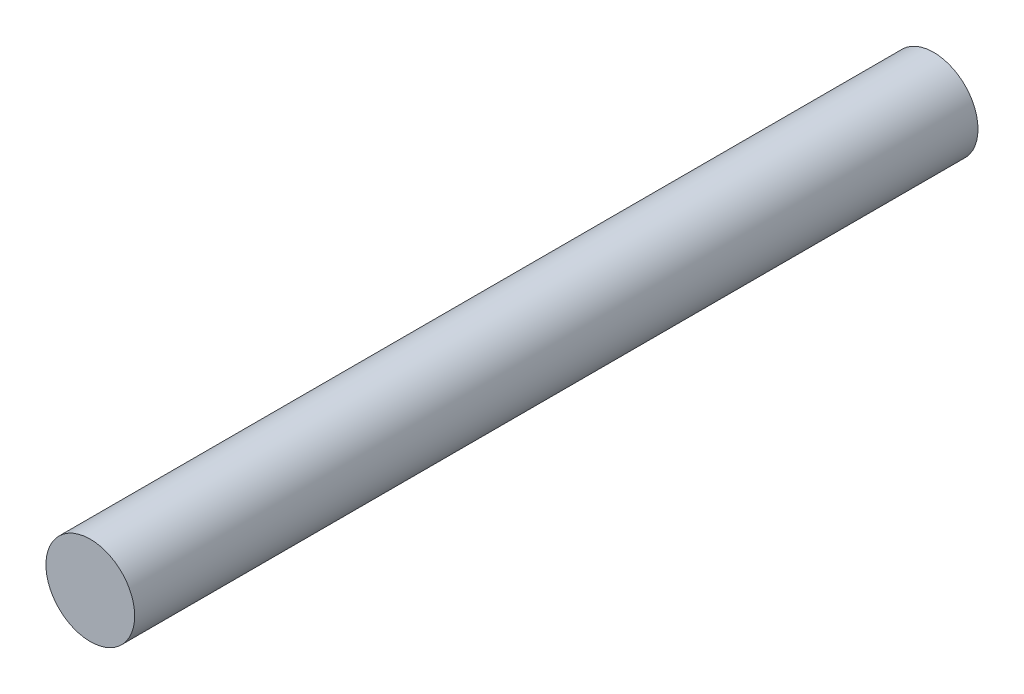
ISO-10303-21;
HEADER;
FILE_DESCRIPTION(('STEP AP214'),'2;1');
FILE_NAME('part.step','',(''),(''),'','','');
FILE_SCHEMA(('AUTOMOTIVE_DESIGN { 1 0 10303 214 1 1 1 1 }'));
ENDSEC;
DATA;
#1=APPLICATION_CONTEXT('core data for automotive mechanical design processes');
#2=APPLICATION_PROTOCOL_DEFINITION('international standard','automotive_design',2000,#1);
#3=PRODUCT_CONTEXT('',#1,'mechanical');
#4=PRODUCT('Part','Part','',(#3));
#5=PRODUCT_RELATED_PRODUCT_CATEGORY('part','',(#4));
#6=PRODUCT_DEFINITION_FORMATION('','',#4);
#7=PRODUCT_DEFINITION_CONTEXT('part definition',#1,'design');
#8=PRODUCT_DEFINITION('design','',#6,#7);
#9=PRODUCT_DEFINITION_SHAPE('','',#8);
#10=(LENGTH_UNIT() NAMED_UNIT(*) SI_UNIT(.MILLI.,.METRE.));
#11=(NAMED_UNIT(*) PLANE_ANGLE_UNIT() SI_UNIT($,.RADIAN.));
#12=(NAMED_UNIT(*) SI_UNIT($,.STERADIAN.) SOLID_ANGLE_UNIT());
#13=UNCERTAINTY_MEASURE_WITH_UNIT(LENGTH_MEASURE(1.E-05),#10,'distance_accuracy_value','');
#14=(GEOMETRIC_REPRESENTATION_CONTEXT(3) GLOBAL_UNCERTAINTY_ASSIGNED_CONTEXT((#13)) GLOBAL_UNIT_ASSIGNED_CONTEXT((#10,
#11,#12)) REPRESENTATION_CONTEXT('',''));
#15=CARTESIAN_POINT('',(0.,0.,0.));
#16=DIRECTION('',(0.,0.,1.));
#17=DIRECTION('',(1.,0.,0.));
#18=AXIS2_PLACEMENT_3D('',#15,#16,#17);
#19=CARTESIAN_POINT('',(0.,0.,38.));
#20=DIRECTION('',(0.,0.,-1.));
#21=DIRECTION('',(-1.,0.,0.));
#22=AXIS2_PLACEMENT_3D('',#19,#20,#21);
#23=CYLINDRICAL_SURFACE('',#22,2.);
#24=CARTESIAN_POINT('',(0.,0.,38.));
#25=DIRECTION('',(0.,0.,1.));
#26=DIRECTION('',(1.,0.,0.));
#27=AXIS2_PLACEMENT_3D('',#24,#25,#26);
#28=CIRCLE('',#27,2.);
#29=CARTESIAN_POINT('',(2.,0.,38.));
#30=VERTEX_POINT('',#29);
#31=EDGE_CURVE('E10',#30,#30,#28,.T.);
#32=ORIENTED_EDGE('',*,*,#31,.F.);
#33=EDGE_LOOP('',(#32));
#34=FACE_BOUND('',#33,.T.);
#35=CARTESIAN_POINT('',(0.,0.,0.));
#36=DIRECTION('',(0.,0.,1.));
#37=DIRECTION('',(1.,0.,0.));
#38=AXIS2_PLACEMENT_3D('',#35,#36,#37);
#39=CIRCLE('',#38,2.);
#40=CARTESIAN_POINT('',(2.,0.,0.));
#41=VERTEX_POINT('',#40);
#42=EDGE_CURVE('E40',#41,#41,#39,.T.);
#43=ORIENTED_EDGE('',*,*,#42,.T.);
#44=EDGE_LOOP('',(#43));
#45=FACE_BOUND('',#44,.T.);
#46=ADVANCED_FACE('F37',(#34,#45),#23,.T.);
#47=CARTESIAN_POINT('',(0.,0.,38.));
#48=DIRECTION('',(0.,0.,1.));
#49=DIRECTION('',(1.,0.,0.));
#50=AXIS2_PLACEMENT_3D('',#47,#48,#49);
#51=PLANE('',#50);
#52=ORIENTED_EDGE('',*,*,#31,.T.);
#53=EDGE_LOOP('',(#52));
#54=FACE_BOUND('',#53,.T.);
#55=ADVANCED_FACE('F52',(#54),#51,.T.);
#56=CARTESIAN_POINT('',(0.,0.,0.));
#57=DIRECTION('',(0.,0.,1.));
#58=DIRECTION('',(1.,0.,0.));
#59=AXIS2_PLACEMENT_3D('',#56,#57,#58);
#60=PLANE('',#59);
#61=ORIENTED_EDGE('',*,*,#42,.F.);
#62=EDGE_LOOP('',(#61));
#63=FACE_BOUND('',#62,.T.);
#64=ADVANCED_FACE('F50',(#63),#60,.F.);
#65=CLOSED_SHELL('',(#46,#55,#64));
#66=MANIFOLD_SOLID_BREP('B2',#65);
#67=ADVANCED_BREP_SHAPE_REPRESENTATION('',(#18,#66),#14);
#68=SHAPE_DEFINITION_REPRESENTATION(#9,#67);
ENDSEC;
END-ISO-10303-21;
